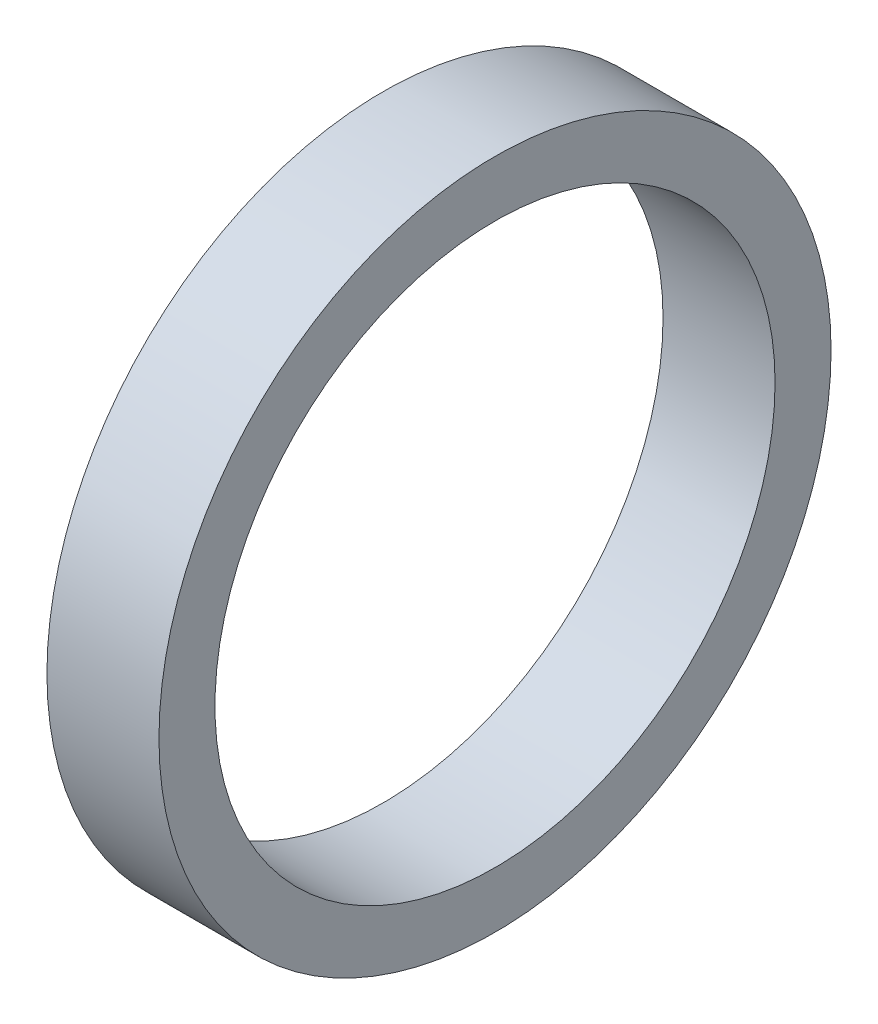
ISO-10303-21;
HEADER;
FILE_DESCRIPTION(('STEP AP214'),'2;1');
FILE_NAME('part.step','',(''),(''),'','','');
FILE_SCHEMA(('AUTOMOTIVE_DESIGN { 1 0 10303 214 1 1 1 1 }'));
ENDSEC;
DATA;
#1=APPLICATION_CONTEXT('core data for automotive mechanical design processes');
#2=APPLICATION_PROTOCOL_DEFINITION('international standard','automotive_design',2000,#1);
#3=PRODUCT_CONTEXT('',#1,'mechanical');
#4=PRODUCT('Part','Part','',(#3));
#5=PRODUCT_RELATED_PRODUCT_CATEGORY('part','',(#4));
#6=PRODUCT_DEFINITION_FORMATION('','',#4);
#7=PRODUCT_DEFINITION_CONTEXT('part definition',#1,'design');
#8=PRODUCT_DEFINITION('design','',#6,#7);
#9=PRODUCT_DEFINITION_SHAPE('','',#8);
#10=(LENGTH_UNIT() NAMED_UNIT(*) SI_UNIT(.MILLI.,.METRE.));
#11=(NAMED_UNIT(*) PLANE_ANGLE_UNIT() SI_UNIT($,.RADIAN.));
#12=(NAMED_UNIT(*) SI_UNIT($,.STERADIAN.) SOLID_ANGLE_UNIT());
#13=UNCERTAINTY_MEASURE_WITH_UNIT(LENGTH_MEASURE(1.E-05),#10,'distance_accuracy_value','');
#14=(GEOMETRIC_REPRESENTATION_CONTEXT(3) GLOBAL_UNCERTAINTY_ASSIGNED_CONTEXT((#13)) GLOBAL_UNIT_ASSIGNED_CONTEXT((#10,
#11,#12)) REPRESENTATION_CONTEXT('',''));
#15=CARTESIAN_POINT('',(0.,0.,0.));
#16=DIRECTION('',(0.,0.,1.));
#17=DIRECTION('',(1.,0.,0.));
#18=AXIS2_PLACEMENT_3D('',#15,#16,#17);
#19=CARTESIAN_POINT('',(3.,0.,0.));
#20=DIRECTION('',(1.,0.,0.));
#21=DIRECTION('',(0.,0.,-1.));
#22=AXIS2_PLACEMENT_3D('',#19,#20,#21);
#23=PLANE('',#22);
#24=CARTESIAN_POINT('',(3.,0.,0.));
#25=DIRECTION('',(1.,0.,0.));
#26=DIRECTION('',(0.,0.,-1.));
#27=AXIS2_PLACEMENT_3D('',#24,#25,#26);
#28=CIRCLE('',#27,9.);
#29=CARTESIAN_POINT('',(3.,0.,-9.));
#30=VERTEX_POINT('',#29);
#31=EDGE_CURVE('E10',#30,#30,#28,.T.);
#32=ORIENTED_EDGE('',*,*,#31,.T.);
#33=EDGE_LOOP('',(#32));
#34=FACE_BOUND('',#33,.T.);
#35=CARTESIAN_POINT('',(3.,0.,0.));
#36=DIRECTION('',(1.,0.,0.));
#37=DIRECTION('',(0.,0.,-1.));
#38=AXIS2_PLACEMENT_3D('',#35,#36,#37);
#39=CIRCLE('',#38,7.5);
#40=CARTESIAN_POINT('',(3.,0.,-7.5));
#41=VERTEX_POINT('',#40);
#42=EDGE_CURVE('E44',#41,#41,#39,.T.);
#43=ORIENTED_EDGE('',*,*,#42,.F.);
#44=EDGE_LOOP('',(#43));
#45=FACE_BOUND('',#44,.T.);
#46=ADVANCED_FACE('F33',(#34,#45),#23,.T.);
#47=CARTESIAN_POINT('',(0.,0.,0.));
#48=DIRECTION('',(1.,0.,0.));
#49=DIRECTION('',(0.,0.,-1.));
#50=AXIS2_PLACEMENT_3D('',#47,#48,#49);
#51=PLANE('',#50);
#52=CARTESIAN_POINT('',(0.,0.,0.));
#53=DIRECTION('',(1.,0.,0.));
#54=DIRECTION('',(0.,0.,-1.));
#55=AXIS2_PLACEMENT_3D('',#52,#53,#54);
#56=CIRCLE('',#55,9.);
#57=CARTESIAN_POINT('',(0.,0.,-9.));
#58=VERTEX_POINT('',#57);
#59=EDGE_CURVE('E37',#58,#58,#56,.T.);
#60=ORIENTED_EDGE('',*,*,#59,.F.);
#61=EDGE_LOOP('',(#60));
#62=FACE_BOUND('',#61,.T.);
#63=CARTESIAN_POINT('',(0.,0.,0.));
#64=DIRECTION('',(1.,0.,0.));
#65=DIRECTION('',(0.,0.,-1.));
#66=AXIS2_PLACEMENT_3D('',#63,#64,#65);
#67=CIRCLE('',#66,7.5);
#68=CARTESIAN_POINT('',(0.,0.,-7.5));
#69=VERTEX_POINT('',#68);
#70=EDGE_CURVE('E46',#69,#69,#67,.T.);
#71=ORIENTED_EDGE('',*,*,#70,.T.);
#72=EDGE_LOOP('',(#71));
#73=FACE_BOUND('',#72,.T.);
#74=ADVANCED_FACE('F56',(#62,#73),#51,.F.);
#75=CARTESIAN_POINT('',(3.,0.,0.));
#76=DIRECTION('',(-1.,0.,0.));
#77=DIRECTION('',(0.,0.,1.));
#78=AXIS2_PLACEMENT_3D('',#75,#76,#77);
#79=CYLINDRICAL_SURFACE('',#78,9.);
#80=ORIENTED_EDGE('',*,*,#31,.F.);
#81=EDGE_LOOP('',(#80));
#82=FACE_BOUND('',#81,.T.);
#83=ORIENTED_EDGE('',*,*,#59,.T.);
#84=EDGE_LOOP('',(#83));
#85=FACE_BOUND('',#84,.T.);
#86=ADVANCED_FACE('F35',(#82,#85),#79,.T.);
#87=CARTESIAN_POINT('',(3.,0.,0.));
#88=DIRECTION('',(-1.,0.,0.));
#89=DIRECTION('',(0.,0.,1.));
#90=AXIS2_PLACEMENT_3D('',#87,#88,#89);
#91=CYLINDRICAL_SURFACE('',#90,7.5);
#92=ORIENTED_EDGE('',*,*,#42,.T.);
#93=EDGE_LOOP('',(#92));
#94=FACE_BOUND('',#93,.T.);
#95=ORIENTED_EDGE('',*,*,#70,.F.);
#96=EDGE_LOOP('',(#95));
#97=FACE_BOUND('',#96,.T.);
#98=ADVANCED_FACE('F52',(#94,#97),#91,.F.);
#99=CLOSED_SHELL('',(#46,#74,#86,#98));
#100=MANIFOLD_SOLID_BREP('B2',#99);
#101=ADVANCED_BREP_SHAPE_REPRESENTATION('',(#18,#100),#14);
#102=SHAPE_DEFINITION_REPRESENTATION(#9,#101);
ENDSEC;
END-ISO-10303-21;
